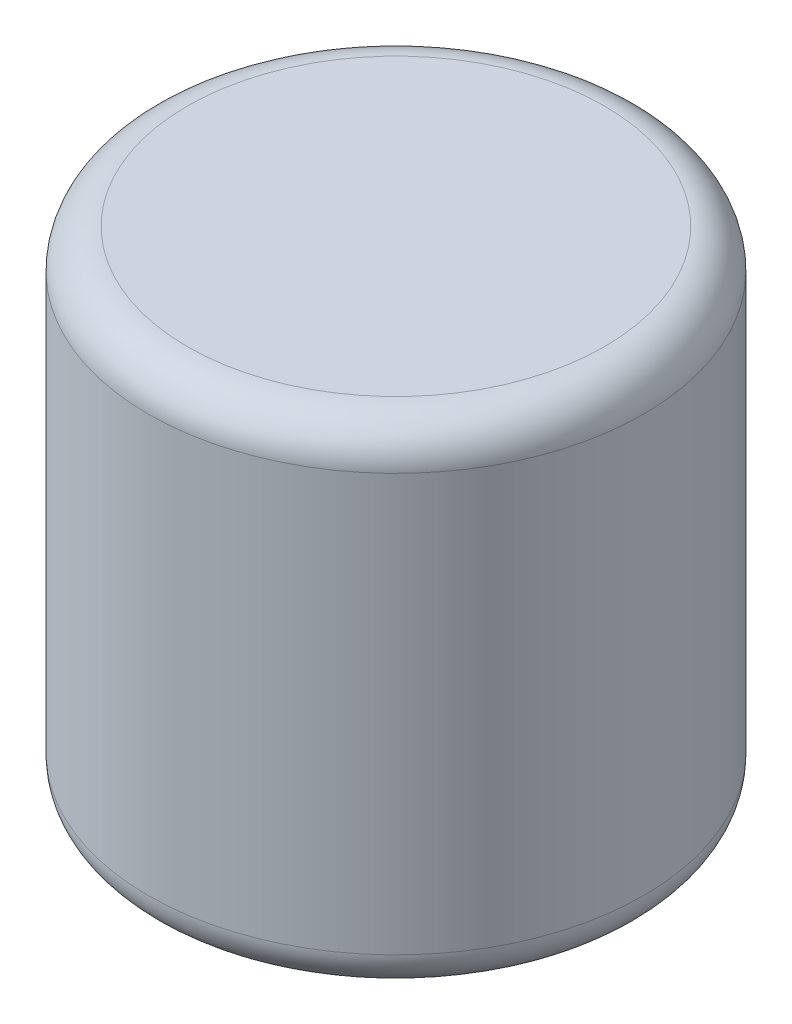
ISO-10303-21;
HEADER;
FILE_DESCRIPTION(('STEP AP214'),'2;1');
FILE_NAME('part.step','',(''),(''),'','','');
FILE_SCHEMA(('AUTOMOTIVE_DESIGN { 1 0 10303 214 1 1 1 1 }'));
ENDSEC;
DATA;
#1=APPLICATION_CONTEXT('core data for automotive mechanical design processes');
#2=APPLICATION_PROTOCOL_DEFINITION('international standard','automotive_design',2000,#1);
#3=PRODUCT_CONTEXT('',#1,'mechanical');
#4=PRODUCT('Part','Part','',(#3));
#5=PRODUCT_RELATED_PRODUCT_CATEGORY('part','',(#4));
#6=PRODUCT_DEFINITION_FORMATION('','',#4);
#7=PRODUCT_DEFINITION_CONTEXT('part definition',#1,'design');
#8=PRODUCT_DEFINITION('design','',#6,#7);
#9=PRODUCT_DEFINITION_SHAPE('','',#8);
#10=(LENGTH_UNIT() NAMED_UNIT(*) SI_UNIT(.MILLI.,.METRE.));
#11=(NAMED_UNIT(*) PLANE_ANGLE_UNIT() SI_UNIT($,.RADIAN.));
#12=(NAMED_UNIT(*) SI_UNIT($,.STERADIAN.) SOLID_ANGLE_UNIT());
#13=UNCERTAINTY_MEASURE_WITH_UNIT(LENGTH_MEASURE(1.E-05),#10,'distance_accuracy_value','');
#14=(GEOMETRIC_REPRESENTATION_CONTEXT(3) GLOBAL_UNCERTAINTY_ASSIGNED_CONTEXT((#13)) GLOBAL_UNIT_ASSIGNED_CONTEXT((#10,
#11,#12)) REPRESENTATION_CONTEXT('',''));
#15=CARTESIAN_POINT('',(0.,0.,0.));
#16=DIRECTION('',(0.,0.,1.));
#17=DIRECTION('',(1.,0.,0.));
#18=AXIS2_PLACEMENT_3D('',#15,#16,#17);
#19=CARTESIAN_POINT('',(0.,3.175,0.));
#20=DIRECTION('',(0.,-1.,0.));
#21=DIRECTION('',(0.,0.,-1.));
#22=AXIS2_PLACEMENT_3D('',#19,#20,#21);
#23=CYLINDRICAL_SURFACE('',#22,3.175);
#24=CARTESIAN_POINT('',(0.,-2.675,0.));
#25=DIRECTION('',(0.,1.,0.));
#26=DIRECTION('',(0.,0.,1.));
#27=AXIS2_PLACEMENT_3D('',#24,#25,#26);
#28=CIRCLE('',#27,3.175);
#29=CARTESIAN_POINT('',(0.,-2.675,3.175));
#30=VERTEX_POINT('',#29);
#31=EDGE_CURVE('E42',#30,#30,#28,.T.);
#32=ORIENTED_EDGE('',*,*,#31,.T.);
#33=EDGE_LOOP('',(#32));
#34=FACE_BOUND('',#33,.T.);
#35=CARTESIAN_POINT('',(0.,2.675,0.));
#36=DIRECTION('',(0.,1.,0.));
#37=DIRECTION('',(0.,0.,1.));
#38=AXIS2_PLACEMENT_3D('',#35,#36,#37);
#39=CIRCLE('',#38,3.175);
#40=CARTESIAN_POINT('',(0.,2.675,3.175));
#41=VERTEX_POINT('',#40);
#42=EDGE_CURVE('E46',#41,#41,#39,.F.);
#43=ORIENTED_EDGE('',*,*,#42,.T.);
#44=EDGE_LOOP('',(#43));
#45=FACE_BOUND('',#44,.T.);
#46=ADVANCED_FACE('F31',(#34,#45),#23,.T.);
#47=CARTESIAN_POINT('',(0.,3.175,0.));
#48=DIRECTION('',(0.,1.,0.));
#49=DIRECTION('',(0.,0.,1.));
#50=AXIS2_PLACEMENT_3D('',#47,#48,#49);
#51=PLANE('',#50);
#52=CARTESIAN_POINT('',(0.,3.175,0.));
#53=DIRECTION('',(0.,1.,0.));
#54=DIRECTION('',(0.,0.,1.));
#55=AXIS2_PLACEMENT_3D('',#52,#53,#54);
#56=CIRCLE('',#55,2.675);
#57=CARTESIAN_POINT('',(0.,3.175,2.675));
#58=VERTEX_POINT('',#57);
#59=EDGE_CURVE('E10',#58,#58,#56,.T.);
#60=ORIENTED_EDGE('',*,*,#59,.T.);
#61=EDGE_LOOP('',(#60));
#62=FACE_BOUND('',#61,.T.);
#63=ADVANCED_FACE('F62',(#62),#51,.T.);
#64=CARTESIAN_POINT('',(0.,-3.175,0.));
#65=DIRECTION('',(0.,1.,0.));
#66=DIRECTION('',(0.,0.,1.));
#67=AXIS2_PLACEMENT_3D('',#64,#65,#66);
#68=PLANE('',#67);
#69=CARTESIAN_POINT('',(0.,-3.175,0.));
#70=DIRECTION('',(0.,1.,0.));
#71=DIRECTION('',(0.,0.,1.));
#72=AXIS2_PLACEMENT_3D('',#69,#70,#71);
#73=CIRCLE('',#72,2.675);
#74=CARTESIAN_POINT('',(0.,-3.175,2.675));
#75=VERTEX_POINT('',#74);
#76=EDGE_CURVE('E38',#75,#75,#73,.F.);
#77=ORIENTED_EDGE('',*,*,#76,.T.);
#78=EDGE_LOOP('',(#77));
#79=FACE_BOUND('',#78,.T.);
#80=ADVANCED_FACE('F59',(#79),#68,.F.);
#81=CARTESIAN_POINT('',(0.,-2.675,0.));
#82=DIRECTION('',(0.,1.,0.));
#83=DIRECTION('',(0.,0.,1.));
#84=AXIS2_PLACEMENT_3D('',#81,#82,#83);
#85=TOROIDAL_SURFACE('',#84,2.675,0.5);
#86=ORIENTED_EDGE('',*,*,#76,.F.);
#87=EDGE_LOOP('',(#86));
#88=FACE_BOUND('',#87,.T.);
#89=ORIENTED_EDGE('',*,*,#31,.F.);
#90=EDGE_LOOP('',(#89));
#91=FACE_BOUND('',#90,.T.);
#92=ADVANCED_FACE('F55',(#88,#91),#85,.T.);
#93=CARTESIAN_POINT('',(0.,2.675,0.));
#94=DIRECTION('',(0.,1.,0.));
#95=DIRECTION('',(0.,0.,1.));
#96=AXIS2_PLACEMENT_3D('',#93,#94,#95);
#97=TOROIDAL_SURFACE('',#96,2.675,0.5);
#98=ORIENTED_EDGE('',*,*,#42,.F.);
#99=EDGE_LOOP('',(#98));
#100=FACE_BOUND('',#99,.T.);
#101=ORIENTED_EDGE('',*,*,#59,.F.);
#102=EDGE_LOOP('',(#101));
#103=FACE_BOUND('',#102,.T.);
#104=ADVANCED_FACE('F33',(#100,#103),#97,.T.);
#105=CLOSED_SHELL('',(#46,#63,#80,#92,#104));
#106=MANIFOLD_SOLID_BREP('B2',#105);
#107=ADVANCED_BREP_SHAPE_REPRESENTATION('',(#18,#106),#14);
#108=SHAPE_DEFINITION_REPRESENTATION(#9,#107);
ENDSEC;
END-ISO-10303-21;
